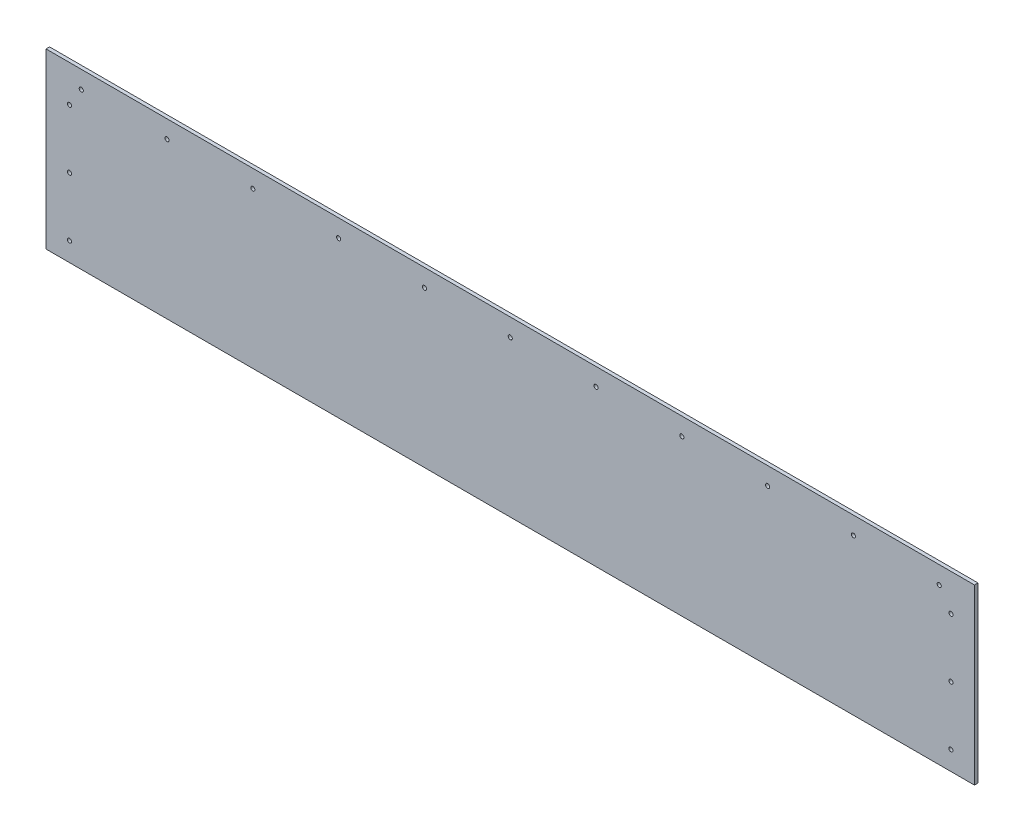
ISO-10303-21;
HEADER;
FILE_DESCRIPTION(('STEP AP214'),'2;1');
FILE_NAME('part.step','',(''),(''),'','','');
FILE_SCHEMA(('AUTOMOTIVE_DESIGN { 1 0 10303 214 1 1 1 1 }'));
ENDSEC;
DATA;
#1=APPLICATION_CONTEXT('core data for automotive mechanical design processes');
#2=APPLICATION_PROTOCOL_DEFINITION('international standard','automotive_design',2000,#1);
#3=PRODUCT_CONTEXT('',#1,'mechanical');
#4=PRODUCT('Part','Part','',(#3));
#5=PRODUCT_RELATED_PRODUCT_CATEGORY('part','',(#4));
#6=PRODUCT_DEFINITION_FORMATION('','',#4);
#7=PRODUCT_DEFINITION_CONTEXT('part definition',#1,'design');
#8=PRODUCT_DEFINITION('design','',#6,#7);
#9=PRODUCT_DEFINITION_SHAPE('','',#8);
#10=(LENGTH_UNIT() NAMED_UNIT(*) SI_UNIT(.MILLI.,.METRE.));
#11=(NAMED_UNIT(*) PLANE_ANGLE_UNIT() SI_UNIT($,.RADIAN.));
#12=(NAMED_UNIT(*) SI_UNIT($,.STERADIAN.) SOLID_ANGLE_UNIT());
#13=UNCERTAINTY_MEASURE_WITH_UNIT(LENGTH_MEASURE(1.E-05),#10,'distance_accuracy_value','');
#14=(GEOMETRIC_REPRESENTATION_CONTEXT(3) GLOBAL_UNCERTAINTY_ASSIGNED_CONTEXT((#13)) GLOBAL_UNIT_ASSIGNED_CONTEXT((#10,
#11,#12)) REPRESENTATION_CONTEXT('',''));
#15=CARTESIAN_POINT('',(0.,0.,0.));
#16=DIRECTION('',(0.,0.,1.));
#17=DIRECTION('',(1.,0.,0.));
#18=AXIS2_PLACEMENT_3D('',#15,#16,#17);
#19=CARTESIAN_POINT('',(0.,1.94289029309402E-13,-6.00000000000006));
#20=DIRECTION('',(0.,0.,1.00000000000001));
#21=DIRECTION('',(1.,0.,0.));
#22=AXIS2_PLACEMENT_3D('',#19,#20,#21);
#23=PLANE('',#22);
#24=CARTESIAN_POINT('',(-749.985464993448,-167.500000000001,-6.00000000000006));
#25=DIRECTION('',(0.,0.,1.00000000000001));
#26=DIRECTION('',(1.,0.,0.));
#27=AXIS2_PLACEMENT_3D('',#24,#25,#26);
#28=CIRCLE('',#27,3.49999999999996);
#29=CARTESIAN_POINT('',(-746.485464993448,-167.500000000001,-6.00000000000006));
#30=VERTEX_POINT('',#29);
#31=EDGE_CURVE('E201',#30,#30,#28,.T.);
#32=ORIENTED_EDGE('',*,*,#31,.T.);
#33=EDGE_LOOP('',(#32));
#34=FACE_BOUND('',#33,.T.);
#35=CARTESIAN_POINT('',(749.985464993448,-267.500000000001,-6.00000000000001));
#36=DIRECTION('',(0.,0.,-1.00000000000001));
#37=DIRECTION('',(-1.,0.,0.));
#38=AXIS2_PLACEMENT_3D('',#35,#36,#37);
#39=CIRCLE('',#38,3.49999999999996);
#40=CARTESIAN_POINT('',(746.485464993448,-267.500000000001,-6.00000000000001));
#41=VERTEX_POINT('',#40);
#42=EDGE_CURVE('E188',#41,#41,#39,.T.);
#43=ORIENTED_EDGE('',*,*,#42,.F.);
#44=EDGE_LOOP('',(#43));
#45=FACE_BOUND('',#44,.T.);
#46=CARTESIAN_POINT('',(749.985464993448,-67.5000000000004,-5.99999999999995));
#47=DIRECTION('',(0.,0.,-1.00000000000001));
#48=DIRECTION('',(-1.,0.,0.));
#49=AXIS2_PLACEMENT_3D('',#46,#47,#48);
#50=CIRCLE('',#49,3.49999999999996);
#51=CARTESIAN_POINT('',(746.485464993448,-67.5000000000004,-5.99999999999995));
#52=VERTEX_POINT('',#51);
#53=EDGE_CURVE('E189',#52,#52,#50,.T.);
#54=ORIENTED_EDGE('',*,*,#53,.F.);
#55=EDGE_LOOP('',(#54));
#56=FACE_BOUND('',#55,.T.);
#57=CARTESIAN_POINT('',(749.985464993448,-167.500000000001,-6.00000000000006));
#58=DIRECTION('',(0.,0.,-1.00000000000001));
#59=DIRECTION('',(-1.,0.,0.));
#60=AXIS2_PLACEMENT_3D('',#57,#58,#59);
#61=CIRCLE('',#60,3.49999999999996);
#62=CARTESIAN_POINT('',(746.485464993448,-167.500000000001,-6.00000000000006));
#63=VERTEX_POINT('',#62);
#64=EDGE_CURVE('E185',#63,#63,#61,.T.);
#65=ORIENTED_EDGE('',*,*,#64,.F.);
#66=EDGE_LOOP('',(#65));
#67=FACE_BOUND('',#66,.T.);
#68=CARTESIAN_POINT('',(730.,-35.0000000000002,-6.00000000000006));
#69=DIRECTION('',(0.,0.,1.00000000000001));
#70=DIRECTION('',(1.,0.,0.));
#71=AXIS2_PLACEMENT_3D('',#68,#69,#70);
#72=CIRCLE('',#71,3.5);
#73=CARTESIAN_POINT('',(733.5,-35.0000000000002,-6.00000000000006));
#74=VERTEX_POINT('',#73);
#75=EDGE_CURVE('E131',#74,#74,#72,.T.);
#76=ORIENTED_EDGE('',*,*,#75,.T.);
#77=EDGE_LOOP('',(#76));
#78=FACE_BOUND('',#77,.T.);
#79=CARTESIAN_POINT('',(584.,-35.0000000000001,-5.99999999999995));
#80=DIRECTION('',(0.,0.,1.00000000000001));
#81=DIRECTION('',(1.,0.,0.));
#82=AXIS2_PLACEMENT_3D('',#79,#80,#81);
#83=CIRCLE('',#82,3.5);
#84=CARTESIAN_POINT('',(587.5,-35.0000000000001,-5.99999999999995));
#85=VERTEX_POINT('',#84);
#86=EDGE_CURVE('E139',#85,#85,#83,.T.);
#87=ORIENTED_EDGE('',*,*,#86,.T.);
#88=EDGE_LOOP('',(#87));
#89=FACE_BOUND('',#88,.T.);
#90=CARTESIAN_POINT('',(438.,-35.0000000000002,-6.00000000000006));
#91=DIRECTION('',(0.,0.,1.00000000000001));
#92=DIRECTION('',(1.,0.,0.));
#93=AXIS2_PLACEMENT_3D('',#90,#91,#92);
#94=CIRCLE('',#93,3.5);
#95=CARTESIAN_POINT('',(441.5,-35.0000000000002,-6.00000000000006));
#96=VERTEX_POINT('',#95);
#97=EDGE_CURVE('E145',#96,#96,#94,.T.);
#98=ORIENTED_EDGE('',*,*,#97,.T.);
#99=EDGE_LOOP('',(#98));
#100=FACE_BOUND('',#99,.T.);
#101=CARTESIAN_POINT('',(292.,-35.0000000000002,-5.99999999999995));
#102=DIRECTION('',(0.,0.,1.00000000000001));
#103=DIRECTION('',(1.,0.,0.));
#104=AXIS2_PLACEMENT_3D('',#101,#102,#103);
#105=CIRCLE('',#104,3.5);
#106=CARTESIAN_POINT('',(295.5,-35.0000000000002,-5.99999999999995));
#107=VERTEX_POINT('',#106);
#108=EDGE_CURVE('E151',#107,#107,#105,.T.);
#109=ORIENTED_EDGE('',*,*,#108,.T.);
#110=EDGE_LOOP('',(#109));
#111=FACE_BOUND('',#110,.T.);
#112=CARTESIAN_POINT('',(146.,-35.0000000000002,-6.00000000000006));
#113=DIRECTION('',(0.,0.,1.00000000000001));
#114=DIRECTION('',(1.,0.,0.));
#115=AXIS2_PLACEMENT_3D('',#112,#113,#114);
#116=CIRCLE('',#115,3.5);
#117=CARTESIAN_POINT('',(149.5,-35.0000000000002,-6.00000000000006));
#118=VERTEX_POINT('',#117);
#119=EDGE_CURVE('E157',#118,#118,#116,.T.);
#120=ORIENTED_EDGE('',*,*,#119,.T.);
#121=EDGE_LOOP('',(#120));
#122=FACE_BOUND('',#121,.T.);
#123=CARTESIAN_POINT('',(-730.,-35.0000000000001,-5.99999999999995));
#124=DIRECTION('',(0.,0.,1.00000000000001));
#125=DIRECTION('',(1.,0.,0.));
#126=AXIS2_PLACEMENT_3D('',#123,#124,#125);
#127=CIRCLE('',#126,3.5);
#128=CARTESIAN_POINT('',(-726.5,-35.0000000000001,-5.99999999999995));
#129=VERTEX_POINT('',#128);
#130=EDGE_CURVE('E163',#129,#129,#127,.T.);
#131=ORIENTED_EDGE('',*,*,#130,.T.);
#132=EDGE_LOOP('',(#131));
#133=FACE_BOUND('',#132,.T.);
#134=CARTESIAN_POINT('',(-584.,-35.0000000000002,-6.00000000000006));
#135=DIRECTION('',(0.,0.,1.00000000000001));
#136=DIRECTION('',(1.,0.,0.));
#137=AXIS2_PLACEMENT_3D('',#134,#135,#136);
#138=CIRCLE('',#137,3.5);
#139=CARTESIAN_POINT('',(-580.5,-35.0000000000002,-6.00000000000006));
#140=VERTEX_POINT('',#139);
#141=EDGE_CURVE('E169',#140,#140,#138,.T.);
#142=ORIENTED_EDGE('',*,*,#141,.T.);
#143=EDGE_LOOP('',(#142));
#144=FACE_BOUND('',#143,.T.);
#145=CARTESIAN_POINT('',(-438.,-35.0000000000001,-5.99999999999995));
#146=DIRECTION('',(0.,0.,1.00000000000001));
#147=DIRECTION('',(1.,0.,0.));
#148=AXIS2_PLACEMENT_3D('',#145,#146,#147);
#149=CIRCLE('',#148,3.5);
#150=CARTESIAN_POINT('',(-434.5,-35.0000000000001,-5.99999999999995));
#151=VERTEX_POINT('',#150);
#152=EDGE_CURVE('E175',#151,#151,#149,.T.);
#153=ORIENTED_EDGE('',*,*,#152,.T.);
#154=EDGE_LOOP('',(#153));
#155=FACE_BOUND('',#154,.T.);
#156=CARTESIAN_POINT('',(-292.,-35.0000000000002,-5.99999999999995));
#157=DIRECTION('',(0.,0.,1.00000000000001));
#158=DIRECTION('',(1.,0.,0.));
#159=AXIS2_PLACEMENT_3D('',#156,#157,#158);
#160=CIRCLE('',#159,3.5);
#161=CARTESIAN_POINT('',(-288.5,-35.0000000000002,-5.99999999999995));
#162=VERTEX_POINT('',#161);
#163=EDGE_CURVE('E130',#162,#162,#160,.T.);
#164=ORIENTED_EDGE('',*,*,#163,.T.);
#165=EDGE_LOOP('',(#164));
#166=FACE_BOUND('',#165,.T.);
#167=CARTESIAN_POINT('',(-146.,-35.0000000000001,-5.99999999999995));
#168=DIRECTION('',(0.,0.,1.00000000000001));
#169=DIRECTION('',(1.,0.,0.));
#170=AXIS2_PLACEMENT_3D('',#167,#168,#169);
#171=CIRCLE('',#170,3.5);
#172=CARTESIAN_POINT('',(-142.5,-35.0000000000001,-5.99999999999995));
#173=VERTEX_POINT('',#172);
#174=EDGE_CURVE('E124',#173,#173,#171,.T.);
#175=ORIENTED_EDGE('',*,*,#174,.T.);
#176=EDGE_LOOP('',(#175));
#177=FACE_BOUND('',#176,.T.);
#178=CARTESIAN_POINT('',(0.,-35.0000000000002,-5.99999999999995));
#179=DIRECTION('',(0.,0.,1.00000000000001));
#180=DIRECTION('',(1.,0.,0.));
#181=AXIS2_PLACEMENT_3D('',#178,#179,#180);
#182=CIRCLE('',#181,3.5);
#183=CARTESIAN_POINT('',(3.5,-35.0000000000002,-5.99999999999995));
#184=VERTEX_POINT('',#183);
#185=EDGE_CURVE('E97',#184,#184,#182,.T.);
#186=ORIENTED_EDGE('',*,*,#185,.T.);
#187=EDGE_LOOP('',(#186));
#188=FACE_BOUND('',#187,.T.);
#189=DIRECTION('',(0.,1.00000000000001,0.));
#190=VECTOR('',#189,1.);
#191=CARTESIAN_POINT('',(789.985464993447,1.52655665885959E-13,-6.00000000000006));
#192=LINE('',#191,#190);
#193=CARTESIAN_POINT('',(789.985464993448,-300.000000000002,-6.00000000000006));
#194=VERTEX_POINT('',#193);
#195=CARTESIAN_POINT('',(789.985464993447,-4.99999999999998,-5.99999999999995));
#196=VERTEX_POINT('',#195);
#197=EDGE_CURVE('E84',#194,#196,#192,.T.);
#198=ORIENTED_EDGE('',*,*,#197,.F.);
#199=DIRECTION('',(1.,0.,0.));
#200=VECTOR('',#199,1.);
#201=CARTESIAN_POINT('',(0.,-300.000000000001,-6.00000000000006));
#202=LINE('',#201,#200);
#203=CARTESIAN_POINT('',(-789.985464993447,-300.000000000001,-6.00000000000006));
#204=VERTEX_POINT('',#203);
#205=EDGE_CURVE('E64',#194,#204,#202,.F.);
#206=ORIENTED_EDGE('',*,*,#205,.T.);
#207=DIRECTION('',(0.,1.00000000000001,0.));
#208=VECTOR('',#207,1.);
#209=CARTESIAN_POINT('',(-789.985464993448,1.38777878078145E-13,-6.00000000000001));
#210=LINE('',#209,#208);
#211=CARTESIAN_POINT('',(-789.985464993448,-4.99999999999999,-5.99999999999995));
#212=VERTEX_POINT('',#211);
#213=EDGE_CURVE('E110',#204,#212,#210,.T.);
#214=ORIENTED_EDGE('',*,*,#213,.T.);
#215=DIRECTION('',(-1.,0.,0.));
#216=VECTOR('',#215,1.);
#217=CARTESIAN_POINT('',(859.985464993449,-4.99999999999998,-6.00000000000006));
#218=LINE('',#217,#216);
#219=EDGE_CURVE('E102',#196,#212,#218,.T.);
#220=ORIENTED_EDGE('',*,*,#219,.F.);
#221=EDGE_LOOP('',(#198,#206,#214,#220));
#222=FACE_BOUND('',#221,.T.);
#223=CARTESIAN_POINT('',(-749.985464993447,-267.500000000002,-6.00000000000012));
#224=DIRECTION('',(0.,0.,1.00000000000001));
#225=DIRECTION('',(1.,0.,0.));
#226=AXIS2_PLACEMENT_3D('',#223,#224,#225);
#227=CIRCLE('',#226,3.49999999999996);
#228=CARTESIAN_POINT('',(-746.485464993447,-267.500000000002,-6.00000000000012));
#229=VERTEX_POINT('',#228);
#230=EDGE_CURVE('E204',#229,#229,#227,.T.);
#231=ORIENTED_EDGE('',*,*,#230,.T.);
#232=EDGE_LOOP('',(#231));
#233=FACE_BOUND('',#232,.T.);
#234=CARTESIAN_POINT('',(-749.985464993447,-67.5000000000003,-6.00000000000006));
#235=DIRECTION('',(0.,0.,1.00000000000001));
#236=DIRECTION('',(1.,0.,0.));
#237=AXIS2_PLACEMENT_3D('',#234,#235,#236);
#238=CIRCLE('',#237,3.49999999999996);
#239=CARTESIAN_POINT('',(-746.485464993447,-67.5000000000003,-6.00000000000006));
#240=VERTEX_POINT('',#239);
#241=EDGE_CURVE('E207',#240,#240,#238,.T.);
#242=ORIENTED_EDGE('',*,*,#241,.T.);
#243=EDGE_LOOP('',(#242));
#244=FACE_BOUND('',#243,.T.);
#245=ADVANCED_FACE('F40',(#34,#45,#56,#67,#78,#89,#100,#111,#122,#133,#144,#155,#166,#177,#188,
#222,#233,#244),#23,.F.);
#246=CARTESIAN_POINT('',(0.,0.,0.));
#247=DIRECTION('',(0.,0.,1.00000000000001));
#248=DIRECTION('',(1.,0.,0.));
#249=AXIS2_PLACEMENT_3D('',#246,#247,#248);
#250=PLANE('',#249);
#251=CARTESIAN_POINT('',(-749.985464993447,-267.500000000002,0.));
#252=DIRECTION('',(0.,0.,1.00000000000001));
#253=DIRECTION('',(1.,0.,0.));
#254=AXIS2_PLACEMENT_3D('',#251,#252,#253);
#255=CIRCLE('',#254,3.49999999999996);
#256=CARTESIAN_POINT('',(-746.485464993447,-267.500000000002,0.));
#257=VERTEX_POINT('',#256);
#258=EDGE_CURVE('E209',#257,#257,#255,.F.);
#259=ORIENTED_EDGE('',*,*,#258,.T.);
#260=EDGE_LOOP('',(#259));
#261=FACE_BOUND('',#260,.T.);
#262=CARTESIAN_POINT('',(-749.985464993448,-167.500000000001,0.));
#263=DIRECTION('',(0.,0.,1.00000000000001));
#264=DIRECTION('',(1.,0.,0.));
#265=AXIS2_PLACEMENT_3D('',#262,#263,#264);
#266=CIRCLE('',#265,3.49999999999996);
#267=CARTESIAN_POINT('',(-746.485464993448,-167.500000000001,0.));
#268=VERTEX_POINT('',#267);
#269=EDGE_CURVE('E196',#268,#268,#266,.F.);
#270=ORIENTED_EDGE('',*,*,#269,.T.);
#271=EDGE_LOOP('',(#270));
#272=FACE_BOUND('',#271,.T.);
#273=CARTESIAN_POINT('',(749.985464993448,-267.500000000002,-1.38777878078145E-13));
#274=DIRECTION('',(0.,0.,1.00000000000001));
#275=DIRECTION('',(1.,0.,0.));
#276=AXIS2_PLACEMENT_3D('',#273,#274,#275);
#277=CIRCLE('',#276,3.49999999999996);
#278=CARTESIAN_POINT('',(753.485464993448,-267.500000000002,-1.38777878078145E-13));
#279=VERTEX_POINT('',#278);
#280=EDGE_CURVE('E192',#279,#279,#277,.T.);
#281=ORIENTED_EDGE('',*,*,#280,.F.);
#282=EDGE_LOOP('',(#281));
#283=FACE_BOUND('',#282,.T.);
#284=CARTESIAN_POINT('',(749.985464993448,-67.5000000000003,0.));
#285=DIRECTION('',(0.,0.,1.00000000000001));
#286=DIRECTION('',(1.,0.,0.));
#287=AXIS2_PLACEMENT_3D('',#284,#285,#286);
#288=CIRCLE('',#287,3.49999999999996);
#289=CARTESIAN_POINT('',(753.485464993448,-67.5000000000003,0.));
#290=VERTEX_POINT('',#289);
#291=EDGE_CURVE('E193',#290,#290,#288,.T.);
#292=ORIENTED_EDGE('',*,*,#291,.F.);
#293=EDGE_LOOP('',(#292));
#294=FACE_BOUND('',#293,.T.);
#295=CARTESIAN_POINT('',(749.985464993448,-167.500000000001,0.));
#296=DIRECTION('',(0.,0.,1.00000000000001));
#297=DIRECTION('',(1.,0.,0.));
#298=AXIS2_PLACEMENT_3D('',#295,#296,#297);
#299=CIRCLE('',#298,3.49999999999996);
#300=CARTESIAN_POINT('',(753.485464993448,-167.500000000001,0.));
#301=VERTEX_POINT('',#300);
#302=EDGE_CURVE('E138',#301,#301,#299,.T.);
#303=ORIENTED_EDGE('',*,*,#302,.F.);
#304=EDGE_LOOP('',(#303));
#305=FACE_BOUND('',#304,.T.);
#306=CARTESIAN_POINT('',(730.,-35.0000000000001,0.));
#307=DIRECTION('',(0.,0.,1.00000000000001));
#308=DIRECTION('',(1.,0.,0.));
#309=AXIS2_PLACEMENT_3D('',#306,#307,#308);
#310=CIRCLE('',#309,3.5);
#311=CARTESIAN_POINT('',(733.5,-35.0000000000001,0.));
#312=VERTEX_POINT('',#311);
#313=EDGE_CURVE('E135',#312,#312,#310,.T.);
#314=ORIENTED_EDGE('',*,*,#313,.F.);
#315=EDGE_LOOP('',(#314));
#316=FACE_BOUND('',#315,.T.);
#317=CARTESIAN_POINT('',(584.,-35.0000000000002,0.));
#318=DIRECTION('',(0.,0.,1.00000000000001));
#319=DIRECTION('',(1.,0.,0.));
#320=AXIS2_PLACEMENT_3D('',#317,#318,#319);
#321=CIRCLE('',#320,3.5);
#322=CARTESIAN_POINT('',(587.5,-35.0000000000002,0.));
#323=VERTEX_POINT('',#322);
#324=EDGE_CURVE('E134',#323,#323,#321,.T.);
#325=ORIENTED_EDGE('',*,*,#324,.F.);
#326=EDGE_LOOP('',(#325));
#327=FACE_BOUND('',#326,.T.);
#328=CARTESIAN_POINT('',(438.,-35.0000000000001,0.));
#329=DIRECTION('',(0.,0.,1.00000000000001));
#330=DIRECTION('',(1.,0.,0.));
#331=AXIS2_PLACEMENT_3D('',#328,#329,#330);
#332=CIRCLE('',#331,3.5);
#333=CARTESIAN_POINT('',(441.5,-35.0000000000001,0.));
#334=VERTEX_POINT('',#333);
#335=EDGE_CURVE('E142',#334,#334,#332,.T.);
#336=ORIENTED_EDGE('',*,*,#335,.F.);
#337=EDGE_LOOP('',(#336));
#338=FACE_BOUND('',#337,.T.);
#339=CARTESIAN_POINT('',(292.,-35.0000000000002,0.));
#340=DIRECTION('',(0.,0.,1.00000000000001));
#341=DIRECTION('',(1.,0.,0.));
#342=AXIS2_PLACEMENT_3D('',#339,#340,#341);
#343=CIRCLE('',#342,3.5);
#344=CARTESIAN_POINT('',(295.5,-35.0000000000002,0.));
#345=VERTEX_POINT('',#344);
#346=EDGE_CURVE('E148',#345,#345,#343,.T.);
#347=ORIENTED_EDGE('',*,*,#346,.F.);
#348=EDGE_LOOP('',(#347));
#349=FACE_BOUND('',#348,.T.);
#350=CARTESIAN_POINT('',(146.,-35.0000000000001,0.));
#351=DIRECTION('',(0.,0.,1.00000000000001));
#352=DIRECTION('',(1.,0.,0.));
#353=AXIS2_PLACEMENT_3D('',#350,#351,#352);
#354=CIRCLE('',#353,3.5);
#355=CARTESIAN_POINT('',(149.5,-35.0000000000001,0.));
#356=VERTEX_POINT('',#355);
#357=EDGE_CURVE('E154',#356,#356,#354,.T.);
#358=ORIENTED_EDGE('',*,*,#357,.F.);
#359=EDGE_LOOP('',(#358));
#360=FACE_BOUND('',#359,.T.);
#361=CARTESIAN_POINT('',(-730.,-35.0000000000002,0.));
#362=DIRECTION('',(0.,0.,1.00000000000001));
#363=DIRECTION('',(1.,0.,0.));
#364=AXIS2_PLACEMENT_3D('',#361,#362,#363);
#365=CIRCLE('',#364,3.5);
#366=CARTESIAN_POINT('',(-726.5,-35.0000000000002,0.));
#367=VERTEX_POINT('',#366);
#368=EDGE_CURVE('E160',#367,#367,#365,.T.);
#369=ORIENTED_EDGE('',*,*,#368,.F.);
#370=EDGE_LOOP('',(#369));
#371=FACE_BOUND('',#370,.T.);
#372=CARTESIAN_POINT('',(-584.,-35.0000000000001,0.));
#373=DIRECTION('',(0.,0.,1.00000000000001));
#374=DIRECTION('',(1.,0.,0.));
#375=AXIS2_PLACEMENT_3D('',#372,#373,#374);
#376=CIRCLE('',#375,3.5);
#377=CARTESIAN_POINT('',(-580.5,-35.0000000000001,0.));
#378=VERTEX_POINT('',#377);
#379=EDGE_CURVE('E166',#378,#378,#376,.T.);
#380=ORIENTED_EDGE('',*,*,#379,.F.);
#381=EDGE_LOOP('',(#380));
#382=FACE_BOUND('',#381,.T.);
#383=CARTESIAN_POINT('',(-438.,-35.0000000000002,0.));
#384=DIRECTION('',(0.,0.,1.00000000000001));
#385=DIRECTION('',(1.,0.,0.));
#386=AXIS2_PLACEMENT_3D('',#383,#384,#385);
#387=CIRCLE('',#386,3.5);
#388=CARTESIAN_POINT('',(-434.5,-35.0000000000002,0.));
#389=VERTEX_POINT('',#388);
#390=EDGE_CURVE('E172',#389,#389,#387,.T.);
#391=ORIENTED_EDGE('',*,*,#390,.F.);
#392=EDGE_LOOP('',(#391));
#393=FACE_BOUND('',#392,.T.);
#394=CARTESIAN_POINT('',(-292.,-35.0000000000002,0.));
#395=DIRECTION('',(0.,0.,1.00000000000001));
#396=DIRECTION('',(1.,0.,0.));
#397=AXIS2_PLACEMENT_3D('',#394,#395,#396);
#398=CIRCLE('',#397,3.5);
#399=CARTESIAN_POINT('',(-288.5,-35.0000000000002,0.));
#400=VERTEX_POINT('',#399);
#401=EDGE_CURVE('E178',#400,#400,#398,.T.);
#402=ORIENTED_EDGE('',*,*,#401,.F.);
#403=EDGE_LOOP('',(#402));
#404=FACE_BOUND('',#403,.T.);
#405=CARTESIAN_POINT('',(-146.,-35.0000000000001,0.));
#406=DIRECTION('',(0.,0.,1.00000000000001));
#407=DIRECTION('',(1.,0.,0.));
#408=AXIS2_PLACEMENT_3D('',#405,#406,#407);
#409=CIRCLE('',#408,3.5);
#410=CARTESIAN_POINT('',(-142.5,-35.0000000000001,0.));
#411=VERTEX_POINT('',#410);
#412=EDGE_CURVE('E127',#411,#411,#409,.T.);
#413=ORIENTED_EDGE('',*,*,#412,.F.);
#414=EDGE_LOOP('',(#413));
#415=FACE_BOUND('',#414,.T.);
#416=CARTESIAN_POINT('',(0.,-35.0000000000002,0.));
#417=DIRECTION('',(0.,0.,1.00000000000001));
#418=DIRECTION('',(1.,0.,0.));
#419=AXIS2_PLACEMENT_3D('',#416,#417,#418);
#420=CIRCLE('',#419,3.5);
#421=CARTESIAN_POINT('',(3.5,-35.0000000000002,0.));
#422=VERTEX_POINT('',#421);
#423=EDGE_CURVE('E121',#422,#422,#420,.T.);
#424=ORIENTED_EDGE('',*,*,#423,.F.);
#425=EDGE_LOOP('',(#424));
#426=FACE_BOUND('',#425,.T.);
#427=DIRECTION('',(-1.,0.,0.));
#428=VECTOR('',#427,1.);
#429=CARTESIAN_POINT('',(0.,-300.000000000001,-1.66533453693773E-13));
#430=LINE('',#429,#428);
#431=CARTESIAN_POINT('',(789.985464993448,-300.000000000001,0.));
#432=VERTEX_POINT('',#431);
#433=CARTESIAN_POINT('',(-789.985464993447,-300.000000000001,1.66533453693773E-13));
#434=VERTEX_POINT('',#433);
#435=EDGE_CURVE('E96',#432,#434,#430,.T.);
#436=ORIENTED_EDGE('',*,*,#435,.F.);
#437=DIRECTION('',(0.,1.00000000000001,0.));
#438=VECTOR('',#437,1.);
#439=CARTESIAN_POINT('',(789.985464993447,-4.99999999999999,0.));
#440=LINE('',#439,#438);
#441=CARTESIAN_POINT('',(789.985464993447,-4.99999999999999,0.));
#442=VERTEX_POINT('',#441);
#443=EDGE_CURVE('E57',#432,#442,#440,.T.);
#444=ORIENTED_EDGE('',*,*,#443,.T.);
#445=DIRECTION('',(-1.,0.,0.));
#446=VECTOR('',#445,1.);
#447=CARTESIAN_POINT('',(859.985464993449,-4.99999999999999,1.38777878078145E-13));
#448=LINE('',#447,#446);
#449=CARTESIAN_POINT('',(-789.985464993448,-5.00000000000003,0.));
#450=VERTEX_POINT('',#449);
#451=EDGE_CURVE('E94',#442,#450,#448,.T.);
#452=ORIENTED_EDGE('',*,*,#451,.T.);
#453=DIRECTION('',(0.,1.00000000000001,0.));
#454=VECTOR('',#453,1.);
#455=CARTESIAN_POINT('',(-789.985464993448,-5.00000000000003,0.));
#456=LINE('',#455,#454);
#457=EDGE_CURVE('E116',#434,#450,#456,.T.);
#458=ORIENTED_EDGE('',*,*,#457,.F.);
#459=EDGE_LOOP('',(#436,#444,#452,#458));
#460=FACE_BOUND('',#459,.T.);
#461=CARTESIAN_POINT('',(-749.985464993447,-67.5000000000002,0.));
#462=DIRECTION('',(0.,0.,1.00000000000001));
#463=DIRECTION('',(1.,0.,0.));
#464=AXIS2_PLACEMENT_3D('',#461,#462,#463);
#465=CIRCLE('',#464,3.49999999999996);
#466=CARTESIAN_POINT('',(-746.485464993447,-67.5000000000002,0.));
#467=VERTEX_POINT('',#466);
#468=EDGE_CURVE('E44',#467,#467,#465,.F.);
#469=ORIENTED_EDGE('',*,*,#468,.T.);
#470=EDGE_LOOP('',(#469));
#471=FACE_BOUND('',#470,.T.);
#472=ADVANCED_FACE('F91',(#261,#272,#283,#294,#305,#316,#327,#338,#349,#360,#371,#382,#393,#404,
#415,#426,#460,#471),#250,.T.);
#473=CARTESIAN_POINT('',(859.985464993449,-4.99999999999998,-6.00000000000006));
#474=DIRECTION('',(0.,1.00000000000001,0.));
#475=DIRECTION('',(0.,0.,1.00000000000001));
#476=AXIS2_PLACEMENT_3D('',#473,#474,#475);
#477=PLANE('',#476);
#478=ORIENTED_EDGE('',*,*,#451,.F.);
#479=DIRECTION('',(0.,0.,1.00000000000001));
#480=VECTOR('',#479,1.);
#481=CARTESIAN_POINT('',(789.985464993447,-5.00000000000007,-10.0000000000001));
#482=LINE('',#481,#480);
#483=EDGE_CURVE('E82',#196,#442,#482,.T.);
#484=ORIENTED_EDGE('',*,*,#483,.F.);
#485=ORIENTED_EDGE('',*,*,#219,.T.);
#486=DIRECTION('',(0.,0.,1.00000000000001));
#487=VECTOR('',#486,1.);
#488=CARTESIAN_POINT('',(-789.985464993448,-5.00000000000009,-10.));
#489=LINE('',#488,#487);
#490=EDGE_CURVE('E101',#212,#450,#489,.T.);
#491=ORIENTED_EDGE('',*,*,#490,.T.);
#492=EDGE_LOOP('',(#478,#484,#485,#491));
#493=FACE_BOUND('',#492,.T.);
#494=ADVANCED_FACE('F42',(#493),#477,.T.);
#495=CARTESIAN_POINT('',(0.,-300.000000000001,-1.66533453693773E-13));
#496=DIRECTION('',(0.,1.00000000000001,0.));
#497=DIRECTION('',(-1.,0.,0.));
#498=AXIS2_PLACEMENT_3D('',#495,#496,#497);
#499=PLANE('',#498);
#500=ORIENTED_EDGE('',*,*,#205,.F.);
#501=DIRECTION('',(0.,0.,-1.00000000000001));
#502=VECTOR('',#501,1.);
#503=CARTESIAN_POINT('',(789.985464993448,-300.000000000001,0.));
#504=LINE('',#503,#502);
#505=EDGE_CURVE('E11',#194,#432,#504,.F.);
#506=ORIENTED_EDGE('',*,*,#505,.T.);
#507=ORIENTED_EDGE('',*,*,#435,.T.);
#508=DIRECTION('',(0.,0.,-1.00000000000001));
#509=VECTOR('',#508,1.);
#510=CARTESIAN_POINT('',(-789.985464993447,-300.000000000001,1.66533453693773E-13));
#511=LINE('',#510,#509);
#512=EDGE_CURVE('E49',#204,#434,#511,.F.);
#513=ORIENTED_EDGE('',*,*,#512,.F.);
#514=EDGE_LOOP('',(#500,#506,#507,#513));
#515=FACE_BOUND('',#514,.T.);
#516=ADVANCED_FACE('F330',(#515),#499,.F.);
#517=CARTESIAN_POINT('',(-789.985464993448,-5.00000000000009,-10.));
#518=DIRECTION('',(1.,0.,0.));
#519=DIRECTION('',(0.,0.,-1.00000000000001));
#520=AXIS2_PLACEMENT_3D('',#517,#518,#519);
#521=PLANE('',#520);
#522=ORIENTED_EDGE('',*,*,#512,.T.);
#523=ORIENTED_EDGE('',*,*,#457,.T.);
#524=ORIENTED_EDGE('',*,*,#490,.F.);
#525=ORIENTED_EDGE('',*,*,#213,.F.);
#526=EDGE_LOOP('',(#522,#523,#524,#525));
#527=FACE_BOUND('',#526,.T.);
#528=ADVANCED_FACE('F327',(#527),#521,.F.);
#529=CARTESIAN_POINT('',(789.985464993447,-5.00000000000007,-10.0000000000001));
#530=DIRECTION('',(1.,0.,0.));
#531=DIRECTION('',(0.,0.,-1.00000000000001));
#532=AXIS2_PLACEMENT_3D('',#529,#530,#531);
#533=PLANE('',#532);
#534=ORIENTED_EDGE('',*,*,#197,.T.);
#535=ORIENTED_EDGE('',*,*,#483,.T.);
#536=ORIENTED_EDGE('',*,*,#443,.F.);
#537=ORIENTED_EDGE('',*,*,#505,.F.);
#538=EDGE_LOOP('',(#534,#535,#536,#537));
#539=FACE_BOUND('',#538,.T.);
#540=ADVANCED_FACE('F83',(#539),#533,.T.);
#541=CARTESIAN_POINT('',(0.,-35.0000000000002,-10.0000000000001));
#542=DIRECTION('',(0.,0.,1.00000000000001));
#543=DIRECTION('',(1.,0.,0.));
#544=AXIS2_PLACEMENT_3D('',#541,#542,#543);
#545=CYLINDRICAL_SURFACE('',#544,3.5);
#546=ORIENTED_EDGE('',*,*,#423,.T.);
#547=EDGE_LOOP('',(#546));
#548=FACE_BOUND('',#547,.T.);
#549=ORIENTED_EDGE('',*,*,#185,.F.);
#550=EDGE_LOOP('',(#549));
#551=FACE_BOUND('',#550,.T.);
#552=ADVANCED_FACE('F248',(#548,#551),#545,.F.);
#553=CARTESIAN_POINT('',(-146.,-35.0000000000002,-10.0000000000001));
#554=DIRECTION('',(0.,0.,1.00000000000001));
#555=DIRECTION('',(1.,0.,0.));
#556=AXIS2_PLACEMENT_3D('',#553,#554,#555);
#557=CYLINDRICAL_SURFACE('',#556,3.5);
#558=ORIENTED_EDGE('',*,*,#412,.T.);
#559=EDGE_LOOP('',(#558));
#560=FACE_BOUND('',#559,.T.);
#561=ORIENTED_EDGE('',*,*,#174,.F.);
#562=EDGE_LOOP('',(#561));
#563=FACE_BOUND('',#562,.T.);
#564=ADVANCED_FACE('F251',(#560,#563),#557,.F.);
#565=CARTESIAN_POINT('',(-292.,-35.0000000000002,-10.0000000000001));
#566=DIRECTION('',(0.,0.,1.00000000000001));
#567=DIRECTION('',(1.,0.,0.));
#568=AXIS2_PLACEMENT_3D('',#565,#566,#567);
#569=CYLINDRICAL_SURFACE('',#568,3.5);
#570=ORIENTED_EDGE('',*,*,#401,.T.);
#571=EDGE_LOOP('',(#570));
#572=FACE_BOUND('',#571,.T.);
#573=ORIENTED_EDGE('',*,*,#163,.F.);
#574=EDGE_LOOP('',(#573));
#575=FACE_BOUND('',#574,.T.);
#576=ADVANCED_FACE('F287',(#572,#575),#569,.F.);
#577=CARTESIAN_POINT('',(-438.,-35.0000000000001,-10.0000000000001));
#578=DIRECTION('',(0.,0.,1.00000000000001));
#579=DIRECTION('',(1.,0.,0.));
#580=AXIS2_PLACEMENT_3D('',#577,#578,#579);
#581=CYLINDRICAL_SURFACE('',#580,3.5);
#582=ORIENTED_EDGE('',*,*,#390,.T.);
#583=EDGE_LOOP('',(#582));
#584=FACE_BOUND('',#583,.T.);
#585=ORIENTED_EDGE('',*,*,#152,.F.);
#586=EDGE_LOOP('',(#585));
#587=FACE_BOUND('',#586,.T.);
#588=ADVANCED_FACE('F290',(#584,#587),#581,.F.);
#589=CARTESIAN_POINT('',(-584.,-35.0000000000002,-9.99999999999995));
#590=DIRECTION('',(0.,0.,1.00000000000001));
#591=DIRECTION('',(1.,0.,0.));
#592=AXIS2_PLACEMENT_3D('',#589,#590,#591);
#593=CYLINDRICAL_SURFACE('',#592,3.5);
#594=ORIENTED_EDGE('',*,*,#379,.T.);
#595=EDGE_LOOP('',(#594));
#596=FACE_BOUND('',#595,.T.);
#597=ORIENTED_EDGE('',*,*,#141,.F.);
#598=EDGE_LOOP('',(#597));
#599=FACE_BOUND('',#598,.T.);
#600=ADVANCED_FACE('F294',(#596,#599),#593,.F.);
#601=CARTESIAN_POINT('',(-730.,-35.0000000000002,-10.0000000000001));
#602=DIRECTION('',(0.,0.,1.00000000000001));
#603=DIRECTION('',(1.,0.,0.));
#604=AXIS2_PLACEMENT_3D('',#601,#602,#603);
#605=CYLINDRICAL_SURFACE('',#604,3.5);
#606=ORIENTED_EDGE('',*,*,#368,.T.);
#607=EDGE_LOOP('',(#606));
#608=FACE_BOUND('',#607,.T.);
#609=ORIENTED_EDGE('',*,*,#130,.F.);
#610=EDGE_LOOP('',(#609));
#611=FACE_BOUND('',#610,.T.);
#612=ADVANCED_FACE('F298',(#608,#611),#605,.F.);
#613=CARTESIAN_POINT('',(146.,-35.0000000000001,-10.));
#614=DIRECTION('',(0.,0.,1.00000000000001));
#615=DIRECTION('',(1.,0.,0.));
#616=AXIS2_PLACEMENT_3D('',#613,#614,#615);
#617=CYLINDRICAL_SURFACE('',#616,3.5);
#618=ORIENTED_EDGE('',*,*,#357,.T.);
#619=EDGE_LOOP('',(#618));
#620=FACE_BOUND('',#619,.T.);
#621=ORIENTED_EDGE('',*,*,#119,.F.);
#622=EDGE_LOOP('',(#621));
#623=FACE_BOUND('',#622,.T.);
#624=ADVANCED_FACE('F302',(#620,#623),#617,.F.);
#625=CARTESIAN_POINT('',(292.,-35.0000000000003,-9.99999999999995));
#626=DIRECTION('',(0.,0.,1.00000000000001));
#627=DIRECTION('',(1.,0.,0.));
#628=AXIS2_PLACEMENT_3D('',#625,#626,#627);
#629=CYLINDRICAL_SURFACE('',#628,3.5);
#630=ORIENTED_EDGE('',*,*,#346,.T.);
#631=EDGE_LOOP('',(#630));
#632=FACE_BOUND('',#631,.T.);
#633=ORIENTED_EDGE('',*,*,#108,.F.);
#634=EDGE_LOOP('',(#633));
#635=FACE_BOUND('',#634,.T.);
#636=ADVANCED_FACE('F306',(#632,#635),#629,.F.);
#637=CARTESIAN_POINT('',(438.,-35.0000000000001,-10.0000000000001));
#638=DIRECTION('',(0.,0.,1.00000000000001));
#639=DIRECTION('',(1.,0.,0.));
#640=AXIS2_PLACEMENT_3D('',#637,#638,#639);
#641=CYLINDRICAL_SURFACE('',#640,3.5);
#642=ORIENTED_EDGE('',*,*,#335,.T.);
#643=EDGE_LOOP('',(#642));
#644=FACE_BOUND('',#643,.T.);
#645=ORIENTED_EDGE('',*,*,#97,.F.);
#646=EDGE_LOOP('',(#645));
#647=FACE_BOUND('',#646,.T.);
#648=ADVANCED_FACE('F310',(#644,#647),#641,.F.);
#649=CARTESIAN_POINT('',(584.,-35.0000000000001,-10.0000000000001));
#650=DIRECTION('',(0.,0.,1.00000000000001));
#651=DIRECTION('',(1.,0.,0.));
#652=AXIS2_PLACEMENT_3D('',#649,#650,#651);
#653=CYLINDRICAL_SURFACE('',#652,3.5);
#654=ORIENTED_EDGE('',*,*,#324,.T.);
#655=EDGE_LOOP('',(#654));
#656=FACE_BOUND('',#655,.T.);
#657=ORIENTED_EDGE('',*,*,#86,.F.);
#658=EDGE_LOOP('',(#657));
#659=FACE_BOUND('',#658,.T.);
#660=ADVANCED_FACE('F314',(#656,#659),#653,.F.);
#661=CARTESIAN_POINT('',(730.,-35.0000000000001,-10.0000000000001));
#662=DIRECTION('',(0.,0.,1.00000000000001));
#663=DIRECTION('',(1.,0.,0.));
#664=AXIS2_PLACEMENT_3D('',#661,#662,#663);
#665=CYLINDRICAL_SURFACE('',#664,3.5);
#666=ORIENTED_EDGE('',*,*,#313,.T.);
#667=EDGE_LOOP('',(#666));
#668=FACE_BOUND('',#667,.T.);
#669=ORIENTED_EDGE('',*,*,#75,.F.);
#670=EDGE_LOOP('',(#669));
#671=FACE_BOUND('',#670,.T.);
#672=ADVANCED_FACE('F286',(#668,#671),#665,.F.);
#673=CARTESIAN_POINT('',(749.985464993448,-167.500000000001,3.99999999999995));
#674=DIRECTION('',(0.,0.,-1.00000000000001));
#675=DIRECTION('',(-1.,0.,0.));
#676=AXIS2_PLACEMENT_3D('',#673,#674,#675);
#677=CYLINDRICAL_SURFACE('',#676,3.49999999999996);
#678=ORIENTED_EDGE('',*,*,#302,.T.);
#679=EDGE_LOOP('',(#678));
#680=FACE_BOUND('',#679,.T.);
#681=ORIENTED_EDGE('',*,*,#64,.T.);
#682=EDGE_LOOP('',(#681));
#683=FACE_BOUND('',#682,.T.);
#684=ADVANCED_FACE('F221',(#680,#683),#677,.F.);
#685=CARTESIAN_POINT('',(749.985464993448,-67.5000000000003,4.00000000000006));
#686=DIRECTION('',(0.,0.,-1.00000000000001));
#687=DIRECTION('',(-1.,0.,0.));
#688=AXIS2_PLACEMENT_3D('',#685,#686,#687);
#689=CYLINDRICAL_SURFACE('',#688,3.49999999999996);
#690=ORIENTED_EDGE('',*,*,#291,.T.);
#691=EDGE_LOOP('',(#690));
#692=FACE_BOUND('',#691,.T.);
#693=ORIENTED_EDGE('',*,*,#53,.T.);
#694=EDGE_LOOP('',(#693));
#695=FACE_BOUND('',#694,.T.);
#696=ADVANCED_FACE('F279',(#692,#695),#689,.F.);
#697=CARTESIAN_POINT('',(749.985464993448,-267.500000000001,3.99999999999998));
#698=DIRECTION('',(0.,0.,-1.00000000000001));
#699=DIRECTION('',(-1.,0.,0.));
#700=AXIS2_PLACEMENT_3D('',#697,#698,#699);
#701=CYLINDRICAL_SURFACE('',#700,3.49999999999996);
#702=ORIENTED_EDGE('',*,*,#280,.T.);
#703=EDGE_LOOP('',(#702));
#704=FACE_BOUND('',#703,.T.);
#705=ORIENTED_EDGE('',*,*,#42,.T.);
#706=EDGE_LOOP('',(#705));
#707=FACE_BOUND('',#706,.T.);
#708=ADVANCED_FACE('F273',(#704,#707),#701,.F.);
#709=CARTESIAN_POINT('',(-749.985464993448,-167.500000000001,4.00000000000006));
#710=DIRECTION('',(0.,0.,-1.00000000000001));
#711=DIRECTION('',(-1.,0.,0.));
#712=AXIS2_PLACEMENT_3D('',#709,#710,#711);
#713=CYLINDRICAL_SURFACE('',#712,3.49999999999996);
#714=ORIENTED_EDGE('',*,*,#269,.F.);
#715=EDGE_LOOP('',(#714));
#716=FACE_BOUND('',#715,.T.);
#717=ORIENTED_EDGE('',*,*,#31,.F.);
#718=EDGE_LOOP('',(#717));
#719=FACE_BOUND('',#718,.T.);
#720=ADVANCED_FACE('F264',(#716,#719),#713,.F.);
#721=CARTESIAN_POINT('',(-749.985464993447,-267.500000000002,4.0000000000002));
#722=DIRECTION('',(0.,0.,-1.00000000000001));
#723=DIRECTION('',(-1.,0.,0.));
#724=AXIS2_PLACEMENT_3D('',#721,#722,#723);
#725=CYLINDRICAL_SURFACE('',#724,3.49999999999996);
#726=ORIENTED_EDGE('',*,*,#258,.F.);
#727=EDGE_LOOP('',(#726));
#728=FACE_BOUND('',#727,.T.);
#729=ORIENTED_EDGE('',*,*,#230,.F.);
#730=EDGE_LOOP('',(#729));
#731=FACE_BOUND('',#730,.T.);
#732=ADVANCED_FACE('F261',(#728,#731),#725,.F.);
#733=CARTESIAN_POINT('',(-749.985464993447,-67.5000000000003,4.00000000000006));
#734=DIRECTION('',(0.,0.,-1.00000000000001));
#735=DIRECTION('',(-1.,0.,0.));
#736=AXIS2_PLACEMENT_3D('',#733,#734,#735);
#737=CYLINDRICAL_SURFACE('',#736,3.49999999999996);
#738=ORIENTED_EDGE('',*,*,#468,.F.);
#739=EDGE_LOOP('',(#738));
#740=FACE_BOUND('',#739,.T.);
#741=ORIENTED_EDGE('',*,*,#241,.F.);
#742=EDGE_LOOP('',(#741));
#743=FACE_BOUND('',#742,.T.);
#744=ADVANCED_FACE('F263',(#740,#743),#737,.F.);
#745=CLOSED_SHELL('',(#245,#472,#494,#516,#528,#540,#552,#564,#576,#588,#600,#612,#624,#636,
#648,#660,#672,#684,#696,#708,#720,#732,#744));
#746=MANIFOLD_SOLID_BREP('B2',#745);
#747=ADVANCED_BREP_SHAPE_REPRESENTATION('',(#18,#746),#14);
#748=SHAPE_DEFINITION_REPRESENTATION(#9,#747);
ENDSEC;
END-ISO-10303-21;
